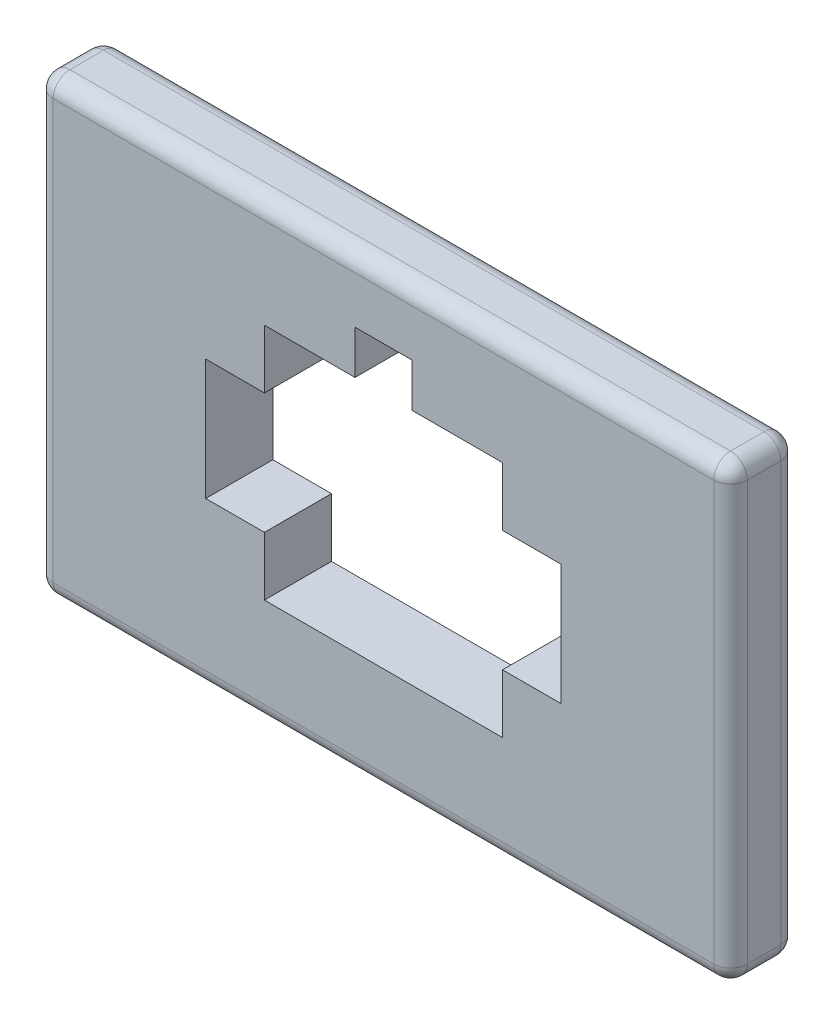
ISO-10303-21;
HEADER;
FILE_DESCRIPTION(('STEP AP214'),'2;1');
FILE_NAME('part.step','',(''),(''),'','','');
FILE_SCHEMA(('AUTOMOTIVE_DESIGN { 1 0 10303 214 1 1 1 1 }'));
ENDSEC;
DATA;
#1=APPLICATION_CONTEXT('core data for automotive mechanical design processes');
#2=APPLICATION_PROTOCOL_DEFINITION('international standard','automotive_design',2000,#1);
#3=PRODUCT_CONTEXT('',#1,'mechanical');
#4=PRODUCT('Part','Part','',(#3));
#5=PRODUCT_RELATED_PRODUCT_CATEGORY('part','',(#4));
#6=PRODUCT_DEFINITION_FORMATION('','',#4);
#7=PRODUCT_DEFINITION_CONTEXT('part definition',#1,'design');
#8=PRODUCT_DEFINITION('design','',#6,#7);
#9=PRODUCT_DEFINITION_SHAPE('','',#8);
#10=(LENGTH_UNIT() NAMED_UNIT(*) SI_UNIT(.MILLI.,.METRE.));
#11=(NAMED_UNIT(*) PLANE_ANGLE_UNIT() SI_UNIT($,.RADIAN.));
#12=(NAMED_UNIT(*) SI_UNIT($,.STERADIAN.) SOLID_ANGLE_UNIT());
#13=UNCERTAINTY_MEASURE_WITH_UNIT(LENGTH_MEASURE(1.E-05),#10,'distance_accuracy_value','');
#14=(GEOMETRIC_REPRESENTATION_CONTEXT(3) GLOBAL_UNCERTAINTY_ASSIGNED_CONTEXT((#13)) GLOBAL_UNIT_ASSIGNED_CONTEXT((#10,
#11,#12)) REPRESENTATION_CONTEXT('',''));
#15=CARTESIAN_POINT('',(0.,0.,0.));
#16=DIRECTION('',(0.,0.,1.));
#17=DIRECTION('',(1.,0.,0.));
#18=AXIS2_PLACEMENT_3D('',#15,#16,#17);
#19=CARTESIAN_POINT('',(10.35,-6.74999999999999,2.));
#20=DIRECTION('',(-1.,0.,0.));
#21=DIRECTION('',(0.,0.,1.));
#22=AXIS2_PLACEMENT_3D('',#19,#20,#21);
#23=PLANE('',#22);
#24=DIRECTION('',(0.,1.,0.));
#25=VECTOR('',#24,1.);
#26=CARTESIAN_POINT('',(10.35,-6.74999999999999,1.5));
#27=LINE('',#26,#25);
#28=CARTESIAN_POINT('',(10.35,6.25000000000001,1.5));
#29=VERTEX_POINT('',#28);
#30=CARTESIAN_POINT('',(10.35,-6.24999999999999,1.5));
#31=VERTEX_POINT('',#30);
#32=EDGE_CURVE('E116',#29,#31,#27,.F.);
#33=ORIENTED_EDGE('',*,*,#32,.T.);
#34=DIRECTION('',(0.,0.,-1.));
#35=VECTOR('',#34,1.);
#36=CARTESIAN_POINT('',(10.35,-6.24999999999999,2.));
#37=LINE('',#36,#35);
#38=CARTESIAN_POINT('',(10.35,-6.24999999999999,0.5));
#39=VERTEX_POINT('',#38);
#40=EDGE_CURVE('E12',#31,#39,#37,.T.);
#41=ORIENTED_EDGE('',*,*,#40,.T.);
#42=DIRECTION('',(0.,1.,0.));
#43=VECTOR('',#42,1.);
#44=CARTESIAN_POINT('',(10.35,6.75000000000001,0.5));
#45=LINE('',#44,#43);
#46=CARTESIAN_POINT('',(10.35,6.25000000000001,0.5));
#47=VERTEX_POINT('',#46);
#48=EDGE_CURVE('E455',#39,#47,#45,.T.);
#49=ORIENTED_EDGE('',*,*,#48,.T.);
#50=DIRECTION('',(0.,0.,-1.));
#51=VECTOR('',#50,1.);
#52=CARTESIAN_POINT('',(10.35,6.25000000000001,2.));
#53=LINE('',#52,#51);
#54=EDGE_CURVE('E457',#47,#29,#53,.F.);
#55=ORIENTED_EDGE('',*,*,#54,.T.);
#56=EDGE_LOOP('',(#33,#41,#49,#55));
#57=FACE_BOUND('',#56,.T.);
#58=ADVANCED_FACE('F107',(#57),#23,.F.);
#59=CARTESIAN_POINT('',(-10.35,6.75000000000001,2.));
#60=DIRECTION('',(0.,-1.,0.));
#61=DIRECTION('',(0.,0.,-1.));
#62=AXIS2_PLACEMENT_3D('',#59,#60,#61);
#63=PLANE('',#62);
#64=DIRECTION('',(0.,0.,-1.));
#65=VECTOR('',#64,1.);
#66=CARTESIAN_POINT('',(-9.84999999999999,6.75000000000001,2.));
#67=LINE('',#66,#65);
#68=CARTESIAN_POINT('',(-9.84999999999999,6.75000000000001,0.5));
#69=VERTEX_POINT('',#68);
#70=CARTESIAN_POINT('',(-9.84999999999999,6.75000000000001,1.5));
#71=VERTEX_POINT('',#70);
#72=EDGE_CURVE('E450',#69,#71,#67,.F.);
#73=ORIENTED_EDGE('',*,*,#72,.T.);
#74=DIRECTION('',(-1.,0.,0.));
#75=VECTOR('',#74,1.);
#76=CARTESIAN_POINT('',(-10.35,6.75000000000001,1.5));
#77=LINE('',#76,#75);
#78=CARTESIAN_POINT('',(9.85000000000001,6.75000000000001,1.5));
#79=VERTEX_POINT('',#78);
#80=EDGE_CURVE('E452',#71,#79,#77,.F.);
#81=ORIENTED_EDGE('',*,*,#80,.T.);
#82=DIRECTION('',(0.,0.,-1.));
#83=VECTOR('',#82,1.);
#84=CARTESIAN_POINT('',(9.85000000000001,6.75000000000001,2.));
#85=LINE('',#84,#83);
#86=CARTESIAN_POINT('',(9.85000000000001,6.75000000000001,0.5));
#87=VERTEX_POINT('',#86);
#88=EDGE_CURVE('E446',#79,#87,#85,.T.);
#89=ORIENTED_EDGE('',*,*,#88,.T.);
#90=DIRECTION('',(-1.,0.,0.));
#91=VECTOR('',#90,1.);
#92=CARTESIAN_POINT('',(-10.35,6.75000000000001,0.5));
#93=LINE('',#92,#91);
#94=EDGE_CURVE('E448',#87,#69,#93,.T.);
#95=ORIENTED_EDGE('',*,*,#94,.T.);
#96=EDGE_LOOP('',(#73,#81,#89,#95));
#97=FACE_BOUND('',#96,.T.);
#98=ADVANCED_FACE('F550',(#97),#63,.F.);
#99=CARTESIAN_POINT('',(-10.35,-6.74999999999999,2.));
#100=DIRECTION('',(1.,0.,0.));
#101=DIRECTION('',(0.,0.,-1.));
#102=AXIS2_PLACEMENT_3D('',#99,#100,#101);
#103=PLANE('',#102);
#104=DIRECTION('',(0.,0.,-1.));
#105=VECTOR('',#104,1.);
#106=CARTESIAN_POINT('',(-10.35,-6.24999999999999,2.));
#107=LINE('',#106,#105);
#108=CARTESIAN_POINT('',(-10.35,-6.24999999999999,0.5));
#109=VERTEX_POINT('',#108);
#110=CARTESIAN_POINT('',(-10.35,-6.24999999999999,1.5));
#111=VERTEX_POINT('',#110);
#112=EDGE_CURVE('E441',#109,#111,#107,.F.);
#113=ORIENTED_EDGE('',*,*,#112,.T.);
#114=DIRECTION('',(0.,-1.,0.));
#115=VECTOR('',#114,1.);
#116=CARTESIAN_POINT('',(-10.35,-6.74999999999999,1.5));
#117=LINE('',#116,#115);
#118=CARTESIAN_POINT('',(-10.35,6.25000000000001,1.5));
#119=VERTEX_POINT('',#118);
#120=EDGE_CURVE('E443',#111,#119,#117,.F.);
#121=ORIENTED_EDGE('',*,*,#120,.T.);
#122=DIRECTION('',(0.,0.,-1.));
#123=VECTOR('',#122,1.);
#124=CARTESIAN_POINT('',(-10.35,6.25000000000001,2.));
#125=LINE('',#124,#123);
#126=CARTESIAN_POINT('',(-10.35,6.25000000000001,0.5));
#127=VERTEX_POINT('',#126);
#128=EDGE_CURVE('E437',#119,#127,#125,.T.);
#129=ORIENTED_EDGE('',*,*,#128,.T.);
#130=DIRECTION('',(0.,-1.,0.));
#131=VECTOR('',#130,1.);
#132=CARTESIAN_POINT('',(-10.35,-6.74999999999999,0.5));
#133=LINE('',#132,#131);
#134=EDGE_CURVE('E439',#127,#109,#133,.T.);
#135=ORIENTED_EDGE('',*,*,#134,.T.);
#136=EDGE_LOOP('',(#113,#121,#129,#135));
#137=FACE_BOUND('',#136,.T.);
#138=ADVANCED_FACE('F541',(#137),#103,.F.);
#139=CARTESIAN_POINT('',(-10.35,-6.74999999999999,2.));
#140=DIRECTION('',(0.,1.,0.));
#141=DIRECTION('',(0.,0.,1.));
#142=AXIS2_PLACEMENT_3D('',#139,#140,#141);
#143=PLANE('',#142);
#144=DIRECTION('',(1.,0.,0.));
#145=VECTOR('',#144,1.);
#146=CARTESIAN_POINT('',(-10.35,-6.74999999999999,1.5));
#147=LINE('',#146,#145);
#148=CARTESIAN_POINT('',(9.85000000000001,-6.74999999999999,1.5));
#149=VERTEX_POINT('',#148);
#150=CARTESIAN_POINT('',(-9.84999999999999,-6.74999999999999,1.5));
#151=VERTEX_POINT('',#150);
#152=EDGE_CURVE('E423',#149,#151,#147,.F.);
#153=ORIENTED_EDGE('',*,*,#152,.T.);
#154=DIRECTION('',(0.,0.,-1.));
#155=VECTOR('',#154,1.);
#156=CARTESIAN_POINT('',(-9.84999999999999,-6.74999999999999,2.));
#157=LINE('',#156,#155);
#158=CARTESIAN_POINT('',(-9.84999999999999,-6.74999999999999,0.5));
#159=VERTEX_POINT('',#158);
#160=EDGE_CURVE('E426',#151,#159,#157,.T.);
#161=ORIENTED_EDGE('',*,*,#160,.T.);
#162=DIRECTION('',(1.,0.,0.));
#163=VECTOR('',#162,1.);
#164=CARTESIAN_POINT('',(10.35,-6.74999999999999,0.5));
#165=LINE('',#164,#163);
#166=CARTESIAN_POINT('',(9.85000000000001,-6.74999999999999,0.5));
#167=VERTEX_POINT('',#166);
#168=EDGE_CURVE('E421',#159,#167,#165,.T.);
#169=ORIENTED_EDGE('',*,*,#168,.T.);
#170=DIRECTION('',(0.,0.,-1.));
#171=VECTOR('',#170,1.);
#172=CARTESIAN_POINT('',(9.85000000000001,-6.74999999999999,2.));
#173=LINE('',#172,#171);
#174=EDGE_CURVE('E419',#167,#149,#173,.F.);
#175=ORIENTED_EDGE('',*,*,#174,.T.);
#176=EDGE_LOOP('',(#153,#161,#169,#175));
#177=FACE_BOUND('',#176,.T.);
#178=ADVANCED_FACE('F643',(#177),#143,.F.);
#179=CARTESIAN_POINT('',(0.,0.,2.));
#180=DIRECTION('',(0.,0.,-1.));
#181=DIRECTION('',(-1.,0.,0.));
#182=AXIS2_PLACEMENT_3D('',#179,#180,#181);
#183=PLANE('',#182);
#184=DIRECTION('',(-1.,0.,0.));
#185=VECTOR('',#184,1.);
#186=CARTESIAN_POINT('',(5.29999999999999,-1.80000000000001,2.));
#187=LINE('',#186,#185);
#188=CARTESIAN_POINT('',(5.29999999999999,-1.80000000000001,2.));
#189=VERTEX_POINT('',#188);
#190=CARTESIAN_POINT('',(3.55000000000002,-1.80000000000001,2.));
#191=VERTEX_POINT('',#190);
#192=EDGE_CURVE('E370',#189,#191,#187,.T.);
#193=ORIENTED_EDGE('',*,*,#192,.T.);
#194=DIRECTION('',(0.,1.,0.));
#195=VECTOR('',#194,1.);
#196=CARTESIAN_POINT('',(3.55000000000002,-3.55000000000001,2.));
#197=LINE('',#196,#195);
#198=CARTESIAN_POINT('',(3.55000000000002,-3.55000000000001,2.));
#199=VERTEX_POINT('',#198);
#200=EDGE_CURVE('E332',#199,#191,#197,.T.);
#201=ORIENTED_EDGE('',*,*,#200,.F.);
#202=DIRECTION('',(-1.,0.,0.));
#203=VECTOR('',#202,1.);
#204=CARTESIAN_POINT('',(3.55000000000002,-3.55000000000001,2.));
#205=LINE('',#204,#203);
#206=CARTESIAN_POINT('',(-3.55000000000003,-3.55000000000001,2.));
#207=VERTEX_POINT('',#206);
#208=EDGE_CURVE('E322',#199,#207,#205,.T.);
#209=ORIENTED_EDGE('',*,*,#208,.T.);
#210=DIRECTION('',(0.,1.,0.));
#211=VECTOR('',#210,1.);
#212=CARTESIAN_POINT('',(-3.55000000000003,-3.55000000000001,2.));
#213=LINE('',#212,#211);
#214=CARTESIAN_POINT('',(-3.55000000000003,-1.80000000000001,2.));
#215=VERTEX_POINT('',#214);
#216=EDGE_CURVE('E325',#207,#215,#213,.T.);
#217=ORIENTED_EDGE('',*,*,#216,.T.);
#218=CARTESIAN_POINT('',(-5.3,-1.80000000000001,2.));
#219=VERTEX_POINT('',#218);
#220=EDGE_CURVE('E389',#215,#219,#187,.T.);
#221=ORIENTED_EDGE('',*,*,#220,.T.);
#222=DIRECTION('',(0.,1.,0.));
#223=VECTOR('',#222,1.);
#224=CARTESIAN_POINT('',(-5.3,-1.80000000000001,2.));
#225=LINE('',#224,#223);
#226=CARTESIAN_POINT('',(-5.3,1.80000000000001,2.));
#227=VERTEX_POINT('',#226);
#228=EDGE_CURVE('E386',#219,#227,#225,.T.);
#229=ORIENTED_EDGE('',*,*,#228,.T.);
#230=DIRECTION('',(-1.,0.,0.));
#231=VECTOR('',#230,1.);
#232=CARTESIAN_POINT('',(5.29999999999999,1.80000000000001,2.));
#233=LINE('',#232,#231);
#234=CARTESIAN_POINT('',(-3.55000000000003,1.80000000000001,2.));
#235=VERTEX_POINT('',#234);
#236=EDGE_CURVE('E382',#235,#227,#233,.T.);
#237=ORIENTED_EDGE('',*,*,#236,.F.);
#238=CARTESIAN_POINT('',(-3.55000000000003,3.55000000000001,2.));
#239=VERTEX_POINT('',#238);
#240=EDGE_CURVE('E337',#235,#239,#213,.T.);
#241=ORIENTED_EDGE('',*,*,#240,.T.);
#242=DIRECTION('',(-1.,0.,0.));
#243=VECTOR('',#242,1.);
#244=CARTESIAN_POINT('',(3.55000000000002,3.55000000000001,2.));
#245=LINE('',#244,#243);
#246=CARTESIAN_POINT('',(-0.850000000000024,3.55000000000001,2.));
#247=VERTEX_POINT('',#246);
#248=EDGE_CURVE('E335',#247,#239,#245,.T.);
#249=ORIENTED_EDGE('',*,*,#248,.F.);
#250=DIRECTION('',(0.,-1.,0.));
#251=VECTOR('',#250,1.);
#252=CARTESIAN_POINT('',(-0.850000000000025,4.85000000000001,2.));
#253=LINE('',#252,#251);
#254=CARTESIAN_POINT('',(-0.850000000000025,4.85000000000001,2.));
#255=VERTEX_POINT('',#254);
#256=EDGE_CURVE('E350',#255,#247,#253,.T.);
#257=ORIENTED_EDGE('',*,*,#256,.F.);
#258=DIRECTION('',(1.,0.,0.));
#259=VECTOR('',#258,1.);
#260=CARTESIAN_POINT('',(-0.850000000000025,4.85000000000001,2.));
#261=LINE('',#260,#259);
#262=CARTESIAN_POINT('',(0.850000000000024,4.85000000000001,2.));
#263=VERTEX_POINT('',#262);
#264=EDGE_CURVE('E356',#255,#263,#261,.T.);
#265=ORIENTED_EDGE('',*,*,#264,.T.);
#266=DIRECTION('',(0.,-1.,0.));
#267=VECTOR('',#266,1.);
#268=CARTESIAN_POINT('',(0.850000000000024,4.85000000000001,2.));
#269=LINE('',#268,#267);
#270=CARTESIAN_POINT('',(0.850000000000024,3.55000000000001,2.));
#271=VERTEX_POINT('',#270);
#272=EDGE_CURVE('E359',#263,#271,#269,.T.);
#273=ORIENTED_EDGE('',*,*,#272,.T.);
#274=CARTESIAN_POINT('',(3.55000000000002,3.55000000000001,2.));
#275=VERTEX_POINT('',#274);
#276=EDGE_CURVE('E124',#275,#271,#245,.T.);
#277=ORIENTED_EDGE('',*,*,#276,.F.);
#278=CARTESIAN_POINT('',(3.55000000000002,1.80000000000001,2.));
#279=VERTEX_POINT('',#278);
#280=EDGE_CURVE('E302',#279,#275,#197,.T.);
#281=ORIENTED_EDGE('',*,*,#280,.F.);
#282=CARTESIAN_POINT('',(5.29999999999999,1.80000000000001,2.));
#283=VERTEX_POINT('',#282);
#284=EDGE_CURVE('E383',#283,#279,#233,.T.);
#285=ORIENTED_EDGE('',*,*,#284,.F.);
#286=DIRECTION('',(0.,1.,0.));
#287=VECTOR('',#286,1.);
#288=CARTESIAN_POINT('',(5.29999999999999,-1.80000000000001,2.));
#289=LINE('',#288,#287);
#290=EDGE_CURVE('E379',#189,#283,#289,.T.);
#291=ORIENTED_EDGE('',*,*,#290,.F.);
#292=EDGE_LOOP('',(#193,#201,#209,#217,#221,#229,#237,#241,#249,#257,#265,#273,#277,#281,#285,#291));
#293=FACE_BOUND('',#292,.T.);
#294=DIRECTION('',(0.,-1.,0.));
#295=VECTOR('',#294,1.);
#296=CARTESIAN_POINT('',(-9.84999999999999,0.,2.));
#297=LINE('',#296,#295);
#298=CARTESIAN_POINT('',(-9.84999999999999,6.25000000000001,2.));
#299=VERTEX_POINT('',#298);
#300=CARTESIAN_POINT('',(-9.84999999999999,-6.24999999999999,2.));
#301=VERTEX_POINT('',#300);
#302=EDGE_CURVE('E414',#299,#301,#297,.T.);
#303=ORIENTED_EDGE('',*,*,#302,.T.);
#304=DIRECTION('',(1.,0.,0.));
#305=VECTOR('',#304,1.);
#306=CARTESIAN_POINT('',(0.,-6.24999999999999,2.));
#307=LINE('',#306,#305);
#308=CARTESIAN_POINT('',(9.85000000000001,-6.24999999999999,2.));
#309=VERTEX_POINT('',#308);
#310=EDGE_CURVE('E416',#301,#309,#307,.T.);
#311=ORIENTED_EDGE('',*,*,#310,.T.);
#312=DIRECTION('',(0.,1.,0.));
#313=VECTOR('',#312,1.);
#314=CARTESIAN_POINT('',(9.85000000000001,0.,2.));
#315=LINE('',#314,#313);
#316=CARTESIAN_POINT('',(9.85000000000001,6.25000000000001,2.));
#317=VERTEX_POINT('',#316);
#318=EDGE_CURVE('E410',#309,#317,#315,.T.);
#319=ORIENTED_EDGE('',*,*,#318,.T.);
#320=DIRECTION('',(-1.,0.,0.));
#321=VECTOR('',#320,1.);
#322=CARTESIAN_POINT('',(0.,6.25000000000001,2.));
#323=LINE('',#322,#321);
#324=EDGE_CURVE('E412',#317,#299,#323,.T.);
#325=ORIENTED_EDGE('',*,*,#324,.T.);
#326=EDGE_LOOP('',(#303,#311,#319,#325));
#327=FACE_BOUND('',#326,.T.);
#328=ADVANCED_FACE('F649',(#293,#327),#183,.F.);
#329=CARTESIAN_POINT('',(0.,0.,0.));
#330=DIRECTION('',(0.,0.,-1.));
#331=DIRECTION('',(-1.,0.,0.));
#332=AXIS2_PLACEMENT_3D('',#329,#330,#331);
#333=PLANE('',#332);
#334=DIRECTION('',(0.,1.,0.));
#335=VECTOR('',#334,1.);
#336=CARTESIAN_POINT('',(3.55000000000002,-3.55000000000001,0.));
#337=LINE('',#336,#335);
#338=CARTESIAN_POINT('',(3.55000000000002,-3.55000000000001,0.));
#339=VERTEX_POINT('',#338);
#340=CARTESIAN_POINT('',(3.55000000000002,-1.80000000000001,0.));
#341=VERTEX_POINT('',#340);
#342=EDGE_CURVE('E321',#339,#341,#337,.T.);
#343=ORIENTED_EDGE('',*,*,#342,.T.);
#344=DIRECTION('',(-1.,0.,0.));
#345=VECTOR('',#344,1.);
#346=CARTESIAN_POINT('',(5.29999999999999,-1.80000000000001,0.));
#347=LINE('',#346,#345);
#348=CARTESIAN_POINT('',(5.29999999999999,-1.80000000000001,0.));
#349=VERTEX_POINT('',#348);
#350=EDGE_CURVE('E375',#349,#341,#347,.T.);
#351=ORIENTED_EDGE('',*,*,#350,.F.);
#352=DIRECTION('',(0.,1.,0.));
#353=VECTOR('',#352,1.);
#354=CARTESIAN_POINT('',(5.29999999999999,-1.80000000000001,0.));
#355=LINE('',#354,#353);
#356=CARTESIAN_POINT('',(5.29999999999999,1.80000000000001,0.));
#357=VERTEX_POINT('',#356);
#358=EDGE_CURVE('E367',#349,#357,#355,.T.);
#359=ORIENTED_EDGE('',*,*,#358,.T.);
#360=DIRECTION('',(-1.,0.,0.));
#361=VECTOR('',#360,1.);
#362=CARTESIAN_POINT('',(5.29999999999999,1.80000000000001,0.));
#363=LINE('',#362,#361);
#364=CARTESIAN_POINT('',(3.55000000000002,1.80000000000001,0.));
#365=VERTEX_POINT('',#364);
#366=EDGE_CURVE('E320',#357,#365,#363,.T.);
#367=ORIENTED_EDGE('',*,*,#366,.T.);
#368=CARTESIAN_POINT('',(3.55000000000002,3.55000000000001,0.));
#369=VERTEX_POINT('',#368);
#370=EDGE_CURVE('E299',#365,#369,#337,.T.);
#371=ORIENTED_EDGE('',*,*,#370,.T.);
#372=DIRECTION('',(-1.,0.,0.));
#373=VECTOR('',#372,1.);
#374=CARTESIAN_POINT('',(3.55000000000002,3.55000000000001,0.));
#375=LINE('',#374,#373);
#376=CARTESIAN_POINT('',(0.850000000000025,3.55000000000001,0.));
#377=VERTEX_POINT('',#376);
#378=EDGE_CURVE('E307',#369,#377,#375,.T.);
#379=ORIENTED_EDGE('',*,*,#378,.T.);
#380=DIRECTION('',(0.,-1.,0.));
#381=VECTOR('',#380,1.);
#382=CARTESIAN_POINT('',(0.850000000000024,4.85000000000001,0.));
#383=LINE('',#382,#381);
#384=CARTESIAN_POINT('',(0.850000000000024,4.85000000000001,0.));
#385=VERTEX_POINT('',#384);
#386=EDGE_CURVE('E349',#385,#377,#383,.T.);
#387=ORIENTED_EDGE('',*,*,#386,.F.);
#388=DIRECTION('',(1.,0.,0.));
#389=VECTOR('',#388,1.);
#390=CARTESIAN_POINT('',(-0.850000000000025,4.85000000000001,0.));
#391=LINE('',#390,#389);
#392=CARTESIAN_POINT('',(-0.850000000000025,4.85000000000001,0.));
#393=VERTEX_POINT('',#392);
#394=EDGE_CURVE('E347',#393,#385,#391,.T.);
#395=ORIENTED_EDGE('',*,*,#394,.F.);
#396=DIRECTION('',(0.,-1.,0.));
#397=VECTOR('',#396,1.);
#398=CARTESIAN_POINT('',(-0.850000000000025,4.85000000000001,0.));
#399=LINE('',#398,#397);
#400=CARTESIAN_POINT('',(-0.850000000000024,3.55000000000001,0.));
#401=VERTEX_POINT('',#400);
#402=EDGE_CURVE('E352',#393,#401,#399,.T.);
#403=ORIENTED_EDGE('',*,*,#402,.T.);
#404=CARTESIAN_POINT('',(-3.55000000000003,3.55000000000001,0.));
#405=VERTEX_POINT('',#404);
#406=EDGE_CURVE('E313',#401,#405,#375,.T.);
#407=ORIENTED_EDGE('',*,*,#406,.T.);
#408=DIRECTION('',(0.,1.,0.));
#409=VECTOR('',#408,1.);
#410=CARTESIAN_POINT('',(-3.55000000000003,-3.55000000000001,0.));
#411=LINE('',#410,#409);
#412=CARTESIAN_POINT('',(-3.55000000000003,1.80000000000001,0.));
#413=VERTEX_POINT('',#412);
#414=EDGE_CURVE('E312',#413,#405,#411,.T.);
#415=ORIENTED_EDGE('',*,*,#414,.F.);
#416=CARTESIAN_POINT('',(-5.3,1.80000000000001,0.));
#417=VERTEX_POINT('',#416);
#418=EDGE_CURVE('E369',#413,#417,#363,.T.);
#419=ORIENTED_EDGE('',*,*,#418,.T.);
#420=DIRECTION('',(0.,1.,0.));
#421=VECTOR('',#420,1.);
#422=CARTESIAN_POINT('',(-5.3,-1.80000000000001,0.));
#423=LINE('',#422,#421);
#424=CARTESIAN_POINT('',(-5.3,-1.80000000000001,0.));
#425=VERTEX_POINT('',#424);
#426=EDGE_CURVE('E372',#425,#417,#423,.T.);
#427=ORIENTED_EDGE('',*,*,#426,.F.);
#428=CARTESIAN_POINT('',(-3.55000000000003,-1.80000000000001,0.));
#429=VERTEX_POINT('',#428);
#430=EDGE_CURVE('E374',#429,#425,#347,.T.);
#431=ORIENTED_EDGE('',*,*,#430,.F.);
#432=CARTESIAN_POINT('',(-3.55000000000003,-3.55000000000001,0.));
#433=VERTEX_POINT('',#432);
#434=EDGE_CURVE('E328',#433,#429,#411,.T.);
#435=ORIENTED_EDGE('',*,*,#434,.F.);
#436=DIRECTION('',(-1.,0.,0.));
#437=VECTOR('',#436,1.);
#438=CARTESIAN_POINT('',(3.55000000000002,-3.55000000000001,0.));
#439=LINE('',#438,#437);
#440=EDGE_CURVE('E304',#339,#433,#439,.T.);
#441=ORIENTED_EDGE('',*,*,#440,.F.);
#442=EDGE_LOOP('',(#343,#351,#359,#367,#371,#379,#387,#395,#403,#407,#415,#419,#427,#431,#435,#441));
#443=FACE_BOUND('',#442,.T.);
#444=DIRECTION('',(0.,1.,0.));
#445=VECTOR('',#444,1.);
#446=CARTESIAN_POINT('',(9.85000000000001,-6.74999999999999,0.));
#447=LINE('',#446,#445);
#448=CARTESIAN_POINT('',(9.85000000000001,6.25000000000001,0.));
#449=VERTEX_POINT('',#448);
#450=CARTESIAN_POINT('',(9.85000000000001,-6.24999999999999,0.));
#451=VERTEX_POINT('',#450);
#452=EDGE_CURVE('E428',#449,#451,#447,.F.);
#453=ORIENTED_EDGE('',*,*,#452,.T.);
#454=DIRECTION('',(1.,0.,0.));
#455=VECTOR('',#454,1.);
#456=CARTESIAN_POINT('',(-10.35,-6.24999999999999,0.));
#457=LINE('',#456,#455);
#458=CARTESIAN_POINT('',(-9.84999999999999,-6.24999999999999,0.));
#459=VERTEX_POINT('',#458);
#460=EDGE_CURVE('E434',#451,#459,#457,.F.);
#461=ORIENTED_EDGE('',*,*,#460,.T.);
#462=DIRECTION('',(0.,-1.,0.));
#463=VECTOR('',#462,1.);
#464=CARTESIAN_POINT('',(-9.84999999999999,6.75000000000001,0.));
#465=LINE('',#464,#463);
#466=CARTESIAN_POINT('',(-9.84999999999999,6.25000000000001,0.));
#467=VERTEX_POINT('',#466);
#468=EDGE_CURVE('E432',#459,#467,#465,.F.);
#469=ORIENTED_EDGE('',*,*,#468,.T.);
#470=DIRECTION('',(-1.,0.,0.));
#471=VECTOR('',#470,1.);
#472=CARTESIAN_POINT('',(10.35,6.25000000000001,0.));
#473=LINE('',#472,#471);
#474=EDGE_CURVE('E430',#467,#449,#473,.F.);
#475=ORIENTED_EDGE('',*,*,#474,.T.);
#476=EDGE_LOOP('',(#453,#461,#469,#475));
#477=FACE_BOUND('',#476,.T.);
#478=ADVANCED_FACE('F316',(#443,#477),#333,.T.);
#479=CARTESIAN_POINT('',(-10.35,6.25000000000001,0.5));
#480=DIRECTION('',(1.,0.,0.));
#481=DIRECTION('',(0.,0.,-1.));
#482=AXIS2_PLACEMENT_3D('',#479,#480,#481);
#483=CYLINDRICAL_SURFACE('',#482,0.5);
#484=CARTESIAN_POINT('',(-9.84999999999999,6.25000000000001,0.5));
#485=DIRECTION('',(-1.,0.,0.));
#486=DIRECTION('',(0.,0.,1.));
#487=AXIS2_PLACEMENT_3D('',#484,#485,#486);
#488=CIRCLE('',#487,0.5);
#489=EDGE_CURVE('E111',#69,#467,#488,.T.);
#490=ORIENTED_EDGE('',*,*,#489,.F.);
#491=ORIENTED_EDGE('',*,*,#94,.F.);
#492=CARTESIAN_POINT('',(9.85000000000001,6.25000000000001,0.5));
#493=DIRECTION('',(1.,0.,0.));
#494=DIRECTION('',(0.,0.,-1.));
#495=AXIS2_PLACEMENT_3D('',#492,#493,#494);
#496=CIRCLE('',#495,0.5);
#497=EDGE_CURVE('E518',#449,#87,#496,.T.);
#498=ORIENTED_EDGE('',*,*,#497,.F.);
#499=ORIENTED_EDGE('',*,*,#474,.F.);
#500=EDGE_LOOP('',(#490,#491,#498,#499));
#501=FACE_BOUND('',#500,.T.);
#502=ADVANCED_FACE('F109',(#501),#483,.T.);
#503=CARTESIAN_POINT('',(-9.84999999999999,6.25000000000001,0.5));
#504=DIRECTION('',(0.,0.,1.));
#505=DIRECTION('',(1.,0.,0.));
#506=AXIS2_PLACEMENT_3D('',#503,#504,#505);
#507=SPHERICAL_SURFACE('',#506,0.5);
#508=CARTESIAN_POINT('',(-9.84999999999999,6.25000000000001,0.5));
#509=DIRECTION('',(0.,0.,-1.));
#510=DIRECTION('',(-1.,0.,0.));
#511=AXIS2_PLACEMENT_3D('',#508,#509,#510);
#512=CIRCLE('',#511,0.5);
#513=EDGE_CURVE('E513',#69,#127,#512,.F.);
#514=ORIENTED_EDGE('',*,*,#513,.F.);
#515=ORIENTED_EDGE('',*,*,#489,.T.);
#516=CARTESIAN_POINT('',(-9.84999999999999,6.25000000000001,0.5));
#517=DIRECTION('',(0.,1.,0.));
#518=DIRECTION('',(0.,0.,1.));
#519=AXIS2_PLACEMENT_3D('',#516,#517,#518);
#520=CIRCLE('',#519,0.5);
#521=EDGE_CURVE('E516',#127,#467,#520,.F.);
#522=ORIENTED_EDGE('',*,*,#521,.F.);
#523=EDGE_LOOP('',(#514,#515,#522));
#524=FACE_BOUND('',#523,.T.);
#525=ADVANCED_FACE('F529',(#524),#507,.T.);
#526=CARTESIAN_POINT('',(9.85000000000001,6.25000000000001,0.5));
#527=DIRECTION('',(0.,0.,1.));
#528=DIRECTION('',(1.,0.,0.));
#529=AXIS2_PLACEMENT_3D('',#526,#527,#528);
#530=SPHERICAL_SURFACE('',#529,0.5);
#531=CARTESIAN_POINT('',(9.85000000000001,6.25000000000001,0.5));
#532=DIRECTION('',(0.,1.,0.));
#533=DIRECTION('',(0.,0.,1.));
#534=AXIS2_PLACEMENT_3D('',#531,#532,#533);
#535=CIRCLE('',#534,0.5);
#536=EDGE_CURVE('E507',#449,#47,#535,.F.);
#537=ORIENTED_EDGE('',*,*,#536,.F.);
#538=ORIENTED_EDGE('',*,*,#497,.T.);
#539=CARTESIAN_POINT('',(9.85000000000001,6.25000000000001,0.5));
#540=DIRECTION('',(0.,0.,-1.));
#541=DIRECTION('',(-1.,0.,0.));
#542=AXIS2_PLACEMENT_3D('',#539,#540,#541);
#543=CIRCLE('',#542,0.5);
#544=EDGE_CURVE('E510',#47,#87,#543,.F.);
#545=ORIENTED_EDGE('',*,*,#544,.F.);
#546=EDGE_LOOP('',(#537,#538,#545));
#547=FACE_BOUND('',#546,.T.);
#548=ADVANCED_FACE('F565',(#547),#530,.T.);
#549=CARTESIAN_POINT('',(-9.84999999999999,-6.74999999999999,0.5));
#550=DIRECTION('',(0.,1.,0.));
#551=DIRECTION('',(0.,0.,1.));
#552=AXIS2_PLACEMENT_3D('',#549,#550,#551);
#553=CYLINDRICAL_SURFACE('',#552,0.5);
#554=ORIENTED_EDGE('',*,*,#521,.T.);
#555=ORIENTED_EDGE('',*,*,#468,.F.);
#556=CARTESIAN_POINT('',(-9.84999999999999,-6.24999999999999,0.5));
#557=DIRECTION('',(0.,-1.,0.));
#558=DIRECTION('',(0.,0.,-1.));
#559=AXIS2_PLACEMENT_3D('',#556,#557,#558);
#560=CIRCLE('',#559,0.5);
#561=EDGE_CURVE('E502',#109,#459,#560,.T.);
#562=ORIENTED_EDGE('',*,*,#561,.F.);
#563=ORIENTED_EDGE('',*,*,#134,.F.);
#564=EDGE_LOOP('',(#554,#555,#562,#563));
#565=FACE_BOUND('',#564,.T.);
#566=ADVANCED_FACE('F537',(#565),#553,.T.);
#567=CARTESIAN_POINT('',(-9.84999999999999,6.25000000000001,2.));
#568=DIRECTION('',(0.,0.,-1.));
#569=DIRECTION('',(-1.,0.,0.));
#570=AXIS2_PLACEMENT_3D('',#567,#568,#569);
#571=CYLINDRICAL_SURFACE('',#570,0.5);
#572=ORIENTED_EDGE('',*,*,#513,.T.);
#573=ORIENTED_EDGE('',*,*,#128,.F.);
#574=CARTESIAN_POINT('',(-9.84999999999999,6.25000000000001,1.5));
#575=DIRECTION('',(0.,0.,1.));
#576=DIRECTION('',(1.,0.,0.));
#577=AXIS2_PLACEMENT_3D('',#574,#575,#576);
#578=CIRCLE('',#577,0.5);
#579=EDGE_CURVE('E499',#71,#119,#578,.T.);
#580=ORIENTED_EDGE('',*,*,#579,.F.);
#581=ORIENTED_EDGE('',*,*,#72,.F.);
#582=EDGE_LOOP('',(#572,#573,#580,#581));
#583=FACE_BOUND('',#582,.T.);
#584=ADVANCED_FACE('F547',(#583),#571,.T.);
#585=CARTESIAN_POINT('',(0.,6.25000000000001,1.5));
#586=DIRECTION('',(-1.,0.,0.));
#587=DIRECTION('',(0.,0.,1.));
#588=AXIS2_PLACEMENT_3D('',#585,#586,#587);
#589=CYLINDRICAL_SURFACE('',#588,0.5);
#590=CARTESIAN_POINT('',(9.85000000000001,6.25000000000001,1.5));
#591=DIRECTION('',(1.,0.,0.));
#592=DIRECTION('',(0.,0.,-1.));
#593=AXIS2_PLACEMENT_3D('',#590,#591,#592);
#594=CIRCLE('',#593,0.5);
#595=EDGE_CURVE('E493',#79,#317,#594,.T.);
#596=ORIENTED_EDGE('',*,*,#595,.F.);
#597=ORIENTED_EDGE('',*,*,#80,.F.);
#598=CARTESIAN_POINT('',(-9.84999999999999,6.25000000000001,1.5));
#599=DIRECTION('',(-1.,0.,0.));
#600=DIRECTION('',(0.,0.,1.));
#601=AXIS2_PLACEMENT_3D('',#598,#599,#600);
#602=CIRCLE('',#601,0.5);
#603=EDGE_CURVE('E496',#299,#71,#602,.T.);
#604=ORIENTED_EDGE('',*,*,#603,.F.);
#605=ORIENTED_EDGE('',*,*,#324,.F.);
#606=EDGE_LOOP('',(#596,#597,#604,#605));
#607=FACE_BOUND('',#606,.T.);
#608=ADVANCED_FACE('F554',(#607),#589,.T.);
#609=CARTESIAN_POINT('',(9.85000000000001,6.25000000000001,2.));
#610=DIRECTION('',(0.,0.,-1.));
#611=DIRECTION('',(-1.,0.,0.));
#612=AXIS2_PLACEMENT_3D('',#609,#610,#611);
#613=CYLINDRICAL_SURFACE('',#612,0.5);
#614=ORIENTED_EDGE('',*,*,#544,.T.);
#615=ORIENTED_EDGE('',*,*,#88,.F.);
#616=CARTESIAN_POINT('',(9.85000000000001,6.25000000000001,1.5));
#617=DIRECTION('',(0.,0.,1.));
#618=DIRECTION('',(1.,0.,0.));
#619=AXIS2_PLACEMENT_3D('',#616,#617,#618);
#620=CIRCLE('',#619,0.5);
#621=EDGE_CURVE('E491',#29,#79,#620,.T.);
#622=ORIENTED_EDGE('',*,*,#621,.F.);
#623=ORIENTED_EDGE('',*,*,#54,.F.);
#624=EDGE_LOOP('',(#614,#615,#622,#623));
#625=FACE_BOUND('',#624,.T.);
#626=ADVANCED_FACE('F562',(#625),#613,.T.);
#627=CARTESIAN_POINT('',(9.85000000000001,-6.74999999999999,0.5));
#628=DIRECTION('',(0.,-1.,0.));
#629=DIRECTION('',(0.,0.,-1.));
#630=AXIS2_PLACEMENT_3D('',#627,#628,#629);
#631=CYLINDRICAL_SURFACE('',#630,0.5);
#632=ORIENTED_EDGE('',*,*,#536,.T.);
#633=ORIENTED_EDGE('',*,*,#48,.F.);
#634=CARTESIAN_POINT('',(9.85000000000001,-6.24999999999999,0.5));
#635=DIRECTION('',(0.,-1.,0.));
#636=DIRECTION('',(0.,0.,-1.));
#637=AXIS2_PLACEMENT_3D('',#634,#635,#636);
#638=CIRCLE('',#637,0.5);
#639=EDGE_CURVE('E488',#451,#39,#638,.T.);
#640=ORIENTED_EDGE('',*,*,#639,.F.);
#641=ORIENTED_EDGE('',*,*,#452,.F.);
#642=EDGE_LOOP('',(#632,#633,#640,#641));
#643=FACE_BOUND('',#642,.T.);
#644=ADVANCED_FACE('F569',(#643),#631,.T.);
#645=CARTESIAN_POINT('',(-10.35,-6.24999999999999,0.5));
#646=DIRECTION('',(-1.,0.,0.));
#647=DIRECTION('',(0.,0.,1.));
#648=AXIS2_PLACEMENT_3D('',#645,#646,#647);
#649=CYLINDRICAL_SURFACE('',#648,0.5);
#650=CARTESIAN_POINT('',(-9.84999999999999,-6.24999999999999,0.5));
#651=DIRECTION('',(-1.,0.,0.));
#652=DIRECTION('',(0.,0.,1.));
#653=AXIS2_PLACEMENT_3D('',#650,#651,#652);
#654=CIRCLE('',#653,0.5);
#655=EDGE_CURVE('E504',#459,#159,#654,.T.);
#656=ORIENTED_EDGE('',*,*,#655,.F.);
#657=ORIENTED_EDGE('',*,*,#460,.F.);
#658=CARTESIAN_POINT('',(9.85000000000001,-6.24999999999999,0.5));
#659=DIRECTION('',(1.,0.,0.));
#660=DIRECTION('',(0.,0.,-1.));
#661=AXIS2_PLACEMENT_3D('',#658,#659,#660);
#662=CIRCLE('',#661,0.5);
#663=EDGE_CURVE('E485',#167,#451,#662,.T.);
#664=ORIENTED_EDGE('',*,*,#663,.F.);
#665=ORIENTED_EDGE('',*,*,#168,.F.);
#666=EDGE_LOOP('',(#656,#657,#664,#665));
#667=FACE_BOUND('',#666,.T.);
#668=ADVANCED_FACE('F574',(#667),#649,.T.);
#669=CARTESIAN_POINT('',(-9.84999999999999,-6.24999999999999,0.5));
#670=DIRECTION('',(0.,0.,1.));
#671=DIRECTION('',(1.,0.,0.));
#672=AXIS2_PLACEMENT_3D('',#669,#670,#671);
#673=SPHERICAL_SURFACE('',#672,0.5);
#674=ORIENTED_EDGE('',*,*,#561,.T.);
#675=ORIENTED_EDGE('',*,*,#655,.T.);
#676=CARTESIAN_POINT('',(-9.84999999999999,-6.24999999999999,0.5));
#677=DIRECTION('',(0.,0.,-1.));
#678=DIRECTION('',(-1.,0.,0.));
#679=AXIS2_PLACEMENT_3D('',#676,#677,#678);
#680=CIRCLE('',#679,0.5);
#681=EDGE_CURVE('E482',#109,#159,#680,.F.);
#682=ORIENTED_EDGE('',*,*,#681,.F.);
#683=EDGE_LOOP('',(#674,#675,#682));
#684=FACE_BOUND('',#683,.T.);
#685=ADVANCED_FACE('F578',(#684),#673,.T.);
#686=CARTESIAN_POINT('',(-9.84999999999999,6.25000000000001,1.5));
#687=DIRECTION('',(0.,0.,1.));
#688=DIRECTION('',(1.,0.,0.));
#689=AXIS2_PLACEMENT_3D('',#686,#687,#688);
#690=SPHERICAL_SURFACE('',#689,0.5);
#691=ORIENTED_EDGE('',*,*,#603,.T.);
#692=ORIENTED_EDGE('',*,*,#579,.T.);
#693=CARTESIAN_POINT('',(-9.84999999999999,6.25000000000001,1.5));
#694=DIRECTION('',(0.,1.,0.));
#695=DIRECTION('',(0.,0.,1.));
#696=AXIS2_PLACEMENT_3D('',#693,#694,#695);
#697=CIRCLE('',#696,0.5);
#698=EDGE_CURVE('E480',#299,#119,#697,.F.);
#699=ORIENTED_EDGE('',*,*,#698,.F.);
#700=EDGE_LOOP('',(#691,#692,#699));
#701=FACE_BOUND('',#700,.T.);
#702=ADVANCED_FACE('F592',(#701),#690,.T.);
#703=CARTESIAN_POINT('',(9.85000000000001,6.25000000000001,1.5));
#704=DIRECTION('',(0.,0.,1.));
#705=DIRECTION('',(1.,0.,0.));
#706=AXIS2_PLACEMENT_3D('',#703,#704,#705);
#707=SPHERICAL_SURFACE('',#706,0.5);
#708=ORIENTED_EDGE('',*,*,#621,.T.);
#709=ORIENTED_EDGE('',*,*,#595,.T.);
#710=CARTESIAN_POINT('',(9.85000000000001,6.25000000000001,1.5));
#711=DIRECTION('',(0.,1.,0.));
#712=DIRECTION('',(0.,0.,1.));
#713=AXIS2_PLACEMENT_3D('',#710,#711,#712);
#714=CIRCLE('',#713,0.5);
#715=EDGE_CURVE('E477',#29,#317,#714,.F.);
#716=ORIENTED_EDGE('',*,*,#715,.F.);
#717=EDGE_LOOP('',(#708,#709,#716));
#718=FACE_BOUND('',#717,.T.);
#719=ADVANCED_FACE('F594',(#718),#707,.T.);
#720=CARTESIAN_POINT('',(9.85000000000001,-6.24999999999999,0.5));
#721=DIRECTION('',(0.,0.,1.));
#722=DIRECTION('',(1.,0.,0.));
#723=AXIS2_PLACEMENT_3D('',#720,#721,#722);
#724=SPHERICAL_SURFACE('',#723,0.5);
#725=ORIENTED_EDGE('',*,*,#663,.T.);
#726=ORIENTED_EDGE('',*,*,#639,.T.);
#727=CARTESIAN_POINT('',(9.85000000000001,-6.24999999999999,0.5));
#728=DIRECTION('',(0.,0.,-1.));
#729=DIRECTION('',(-1.,0.,0.));
#730=AXIS2_PLACEMENT_3D('',#727,#728,#729);
#731=CIRCLE('',#730,0.5);
#732=EDGE_CURVE('E475',#167,#39,#731,.F.);
#733=ORIENTED_EDGE('',*,*,#732,.F.);
#734=EDGE_LOOP('',(#725,#726,#733));
#735=FACE_BOUND('',#734,.T.);
#736=ADVANCED_FACE('F600',(#735),#724,.T.);
#737=CARTESIAN_POINT('',(-9.84999999999999,-6.24999999999999,2.));
#738=DIRECTION('',(0.,0.,-1.));
#739=DIRECTION('',(-1.,0.,0.));
#740=AXIS2_PLACEMENT_3D('',#737,#738,#739);
#741=CYLINDRICAL_SURFACE('',#740,0.5);
#742=ORIENTED_EDGE('',*,*,#681,.T.);
#743=ORIENTED_EDGE('',*,*,#160,.F.);
#744=CARTESIAN_POINT('',(-9.84999999999999,-6.24999999999999,1.5));
#745=DIRECTION('',(0.,0.,1.));
#746=DIRECTION('',(1.,0.,0.));
#747=AXIS2_PLACEMENT_3D('',#744,#745,#746);
#748=CIRCLE('',#747,0.5);
#749=EDGE_CURVE('E472',#111,#151,#748,.T.);
#750=ORIENTED_EDGE('',*,*,#749,.F.);
#751=ORIENTED_EDGE('',*,*,#112,.F.);
#752=EDGE_LOOP('',(#742,#743,#750,#751));
#753=FACE_BOUND('',#752,.T.);
#754=ADVANCED_FACE('F581',(#753),#741,.T.);
#755=CARTESIAN_POINT('',(-9.84999999999999,0.,1.5));
#756=DIRECTION('',(0.,-1.,0.));
#757=DIRECTION('',(0.,0.,-1.));
#758=AXIS2_PLACEMENT_3D('',#755,#756,#757);
#759=CYLINDRICAL_SURFACE('',#758,0.5);
#760=ORIENTED_EDGE('',*,*,#698,.T.);
#761=ORIENTED_EDGE('',*,*,#120,.F.);
#762=CARTESIAN_POINT('',(-9.84999999999999,-6.24999999999999,1.5));
#763=DIRECTION('',(0.,-1.,0.));
#764=DIRECTION('',(0.,0.,-1.));
#765=AXIS2_PLACEMENT_3D('',#762,#763,#764);
#766=CIRCLE('',#765,0.5);
#767=EDGE_CURVE('E469',#301,#111,#766,.T.);
#768=ORIENTED_EDGE('',*,*,#767,.F.);
#769=ORIENTED_EDGE('',*,*,#302,.F.);
#770=EDGE_LOOP('',(#760,#761,#768,#769));
#771=FACE_BOUND('',#770,.T.);
#772=ADVANCED_FACE('F590',(#771),#759,.T.);
#773=CARTESIAN_POINT('',(9.85000000000001,0.,1.5));
#774=DIRECTION('',(0.,1.,0.));
#775=DIRECTION('',(0.,0.,1.));
#776=AXIS2_PLACEMENT_3D('',#773,#774,#775);
#777=CYLINDRICAL_SURFACE('',#776,0.5);
#778=ORIENTED_EDGE('',*,*,#715,.T.);
#779=ORIENTED_EDGE('',*,*,#318,.F.);
#780=CARTESIAN_POINT('',(9.85000000000001,-6.24999999999999,1.5));
#781=DIRECTION('',(0.,-1.,0.));
#782=DIRECTION('',(0.,0.,-1.));
#783=AXIS2_PLACEMENT_3D('',#780,#781,#782);
#784=CIRCLE('',#783,0.5);
#785=EDGE_CURVE('E466',#31,#309,#784,.T.);
#786=ORIENTED_EDGE('',*,*,#785,.F.);
#787=ORIENTED_EDGE('',*,*,#32,.F.);
#788=EDGE_LOOP('',(#778,#779,#786,#787));
#789=FACE_BOUND('',#788,.T.);
#790=ADVANCED_FACE('F625',(#789),#777,.T.);
#791=CARTESIAN_POINT('',(9.85000000000001,-6.24999999999999,2.));
#792=DIRECTION('',(0.,0.,-1.));
#793=DIRECTION('',(-1.,0.,0.));
#794=AXIS2_PLACEMENT_3D('',#791,#792,#793);
#795=CYLINDRICAL_SURFACE('',#794,0.5);
#796=ORIENTED_EDGE('',*,*,#732,.T.);
#797=ORIENTED_EDGE('',*,*,#40,.F.);
#798=CARTESIAN_POINT('',(9.85000000000001,-6.24999999999999,1.5));
#799=DIRECTION('',(0.,0.,1.));
#800=DIRECTION('',(1.,0.,0.));
#801=AXIS2_PLACEMENT_3D('',#798,#799,#800);
#802=CIRCLE('',#801,0.5);
#803=EDGE_CURVE('E463',#149,#31,#802,.T.);
#804=ORIENTED_EDGE('',*,*,#803,.F.);
#805=ORIENTED_EDGE('',*,*,#174,.F.);
#806=EDGE_LOOP('',(#796,#797,#804,#805));
#807=FACE_BOUND('',#806,.T.);
#808=ADVANCED_FACE('F622',(#807),#795,.T.);
#809=CARTESIAN_POINT('',(-9.84999999999999,-6.24999999999999,1.5));
#810=DIRECTION('',(0.,0.,1.));
#811=DIRECTION('',(1.,0.,0.));
#812=AXIS2_PLACEMENT_3D('',#809,#810,#811);
#813=SPHERICAL_SURFACE('',#812,0.5);
#814=ORIENTED_EDGE('',*,*,#767,.T.);
#815=ORIENTED_EDGE('',*,*,#749,.T.);
#816=CARTESIAN_POINT('',(-9.84999999999999,-6.24999999999999,1.5));
#817=DIRECTION('',(-1.,0.,0.));
#818=DIRECTION('',(0.,0.,1.));
#819=AXIS2_PLACEMENT_3D('',#816,#817,#818);
#820=CIRCLE('',#819,0.5);
#821=EDGE_CURVE('E461',#301,#151,#820,.F.);
#822=ORIENTED_EDGE('',*,*,#821,.F.);
#823=EDGE_LOOP('',(#814,#815,#822));
#824=FACE_BOUND('',#823,.T.);
#825=ADVANCED_FACE('F586',(#824),#813,.T.);
#826=CARTESIAN_POINT('',(9.85000000000001,-6.24999999999999,1.5));
#827=DIRECTION('',(0.,0.,1.));
#828=DIRECTION('',(1.,0.,0.));
#829=AXIS2_PLACEMENT_3D('',#826,#827,#828);
#830=SPHERICAL_SURFACE('',#829,0.5);
#831=ORIENTED_EDGE('',*,*,#803,.T.);
#832=ORIENTED_EDGE('',*,*,#785,.T.);
#833=CARTESIAN_POINT('',(9.85000000000001,-6.24999999999999,1.5));
#834=DIRECTION('',(1.,0.,0.));
#835=DIRECTION('',(0.,0.,-1.));
#836=AXIS2_PLACEMENT_3D('',#833,#834,#835);
#837=CIRCLE('',#836,0.5);
#838=EDGE_CURVE('E407',#149,#309,#837,.F.);
#839=ORIENTED_EDGE('',*,*,#838,.F.);
#840=EDGE_LOOP('',(#831,#832,#839));
#841=FACE_BOUND('',#840,.T.);
#842=ADVANCED_FACE('F615',(#841),#830,.T.);
#843=CARTESIAN_POINT('',(0.,-6.24999999999999,1.5));
#844=DIRECTION('',(1.,0.,0.));
#845=DIRECTION('',(0.,0.,-1.));
#846=AXIS2_PLACEMENT_3D('',#843,#844,#845);
#847=CYLINDRICAL_SURFACE('',#846,0.5);
#848=ORIENTED_EDGE('',*,*,#821,.T.);
#849=ORIENTED_EDGE('',*,*,#152,.F.);
#850=ORIENTED_EDGE('',*,*,#838,.T.);
#851=ORIENTED_EDGE('',*,*,#310,.F.);
#852=EDGE_LOOP('',(#848,#849,#850,#851));
#853=FACE_BOUND('',#852,.T.);
#854=ADVANCED_FACE('F612',(#853),#847,.T.);
#855=CARTESIAN_POINT('',(3.55000000000002,-3.55000000000001,0.));
#856=DIRECTION('',(1.,0.,0.));
#857=DIRECTION('',(0.,0.,-1.));
#858=AXIS2_PLACEMENT_3D('',#855,#856,#857);
#859=PLANE('',#858);
#860=DIRECTION('',(0.,0.,1.));
#861=VECTOR('',#860,1.);
#862=CARTESIAN_POINT('',(3.55000000000002,1.80000000000001,0.));
#863=LINE('',#862,#861);
#864=EDGE_CURVE('E405',#365,#279,#863,.T.);
#865=ORIENTED_EDGE('',*,*,#864,.T.);
#866=ORIENTED_EDGE('',*,*,#280,.T.);
#867=DIRECTION('',(0.,0.,1.));
#868=VECTOR('',#867,1.);
#869=CARTESIAN_POINT('',(3.55000000000002,3.55000000000001,0.));
#870=LINE('',#869,#868);
#871=EDGE_CURVE('E295',#369,#275,#870,.T.);
#872=ORIENTED_EDGE('',*,*,#871,.F.);
#873=ORIENTED_EDGE('',*,*,#370,.F.);
#874=EDGE_LOOP('',(#865,#866,#872,#873));
#875=FACE_BOUND('',#874,.T.);
#876=ADVANCED_FACE('F297',(#875),#859,.F.);
#877=CARTESIAN_POINT('',(3.55000000000002,3.55000000000001,0.));
#878=DIRECTION('',(0.,1.,0.));
#879=DIRECTION('',(0.,0.,1.));
#880=AXIS2_PLACEMENT_3D('',#877,#878,#879);
#881=PLANE('',#880);
#882=ORIENTED_EDGE('',*,*,#378,.F.);
#883=ORIENTED_EDGE('',*,*,#871,.T.);
#884=ORIENTED_EDGE('',*,*,#276,.T.);
#885=DIRECTION('',(0.,0.,1.));
#886=VECTOR('',#885,1.);
#887=CARTESIAN_POINT('',(0.850000000000024,3.55000000000001,0.));
#888=LINE('',#887,#886);
#889=EDGE_CURVE('E309',#377,#271,#888,.T.);
#890=ORIENTED_EDGE('',*,*,#889,.F.);
#891=EDGE_LOOP('',(#882,#883,#884,#890));
#892=FACE_BOUND('',#891,.T.);
#893=ADVANCED_FACE('F308',(#892),#881,.F.);
#894=CARTESIAN_POINT('',(3.55000000000002,-3.55000000000001,0.));
#895=DIRECTION('',(0.,1.,0.));
#896=DIRECTION('',(0.,0.,1.));
#897=AXIS2_PLACEMENT_3D('',#894,#895,#896);
#898=PLANE('',#897);
#899=ORIENTED_EDGE('',*,*,#208,.F.);
#900=DIRECTION('',(0.,0.,1.));
#901=VECTOR('',#900,1.);
#902=CARTESIAN_POINT('',(3.55000000000002,-3.55000000000001,0.));
#903=LINE('',#902,#901);
#904=EDGE_CURVE('E340',#339,#199,#903,.T.);
#905=ORIENTED_EDGE('',*,*,#904,.F.);
#906=ORIENTED_EDGE('',*,*,#440,.T.);
#907=DIRECTION('',(0.,0.,1.));
#908=VECTOR('',#907,1.);
#909=CARTESIAN_POINT('',(-3.55000000000003,-3.55000000000001,0.));
#910=LINE('',#909,#908);
#911=EDGE_CURVE('E343',#433,#207,#910,.T.);
#912=ORIENTED_EDGE('',*,*,#911,.T.);
#913=EDGE_LOOP('',(#899,#905,#906,#912));
#914=FACE_BOUND('',#913,.T.);
#915=ADVANCED_FACE('F808',(#914),#898,.T.);
#916=CARTESIAN_POINT('',(-3.55000000000003,-3.55000000000001,0.));
#917=DIRECTION('',(1.,0.,0.));
#918=DIRECTION('',(0.,0.,-1.));
#919=AXIS2_PLACEMENT_3D('',#916,#917,#918);
#920=PLANE('',#919);
#921=DIRECTION('',(0.,0.,1.));
#922=VECTOR('',#921,1.);
#923=CARTESIAN_POINT('',(-3.55000000000003,-1.80000000000001,0.));
#924=LINE('',#923,#922);
#925=EDGE_CURVE('E401',#429,#215,#924,.T.);
#926=ORIENTED_EDGE('',*,*,#925,.T.);
#927=ORIENTED_EDGE('',*,*,#216,.F.);
#928=ORIENTED_EDGE('',*,*,#911,.F.);
#929=ORIENTED_EDGE('',*,*,#434,.T.);
#930=EDGE_LOOP('',(#926,#927,#928,#929));
#931=FACE_BOUND('',#930,.T.);
#932=ADVANCED_FACE('F816',(#931),#920,.T.);
#933=ORIENTED_EDGE('',*,*,#342,.F.);
#934=ORIENTED_EDGE('',*,*,#904,.T.);
#935=ORIENTED_EDGE('',*,*,#200,.T.);
#936=DIRECTION('',(0.,0.,1.));
#937=VECTOR('',#936,1.);
#938=CARTESIAN_POINT('',(3.55000000000002,-1.80000000000001,0.));
#939=LINE('',#938,#937);
#940=EDGE_CURVE('E403',#341,#191,#939,.T.);
#941=ORIENTED_EDGE('',*,*,#940,.F.);
#942=EDGE_LOOP('',(#933,#934,#935,#941));
#943=FACE_BOUND('',#942,.T.);
#944=ADVANCED_FACE('F803',(#943),#859,.F.);
#945=ORIENTED_EDGE('',*,*,#414,.T.);
#946=DIRECTION('',(0.,0.,1.));
#947=VECTOR('',#946,1.);
#948=CARTESIAN_POINT('',(-3.55000000000003,3.55000000000001,0.));
#949=LINE('',#948,#947);
#950=EDGE_CURVE('E303',#405,#239,#949,.T.);
#951=ORIENTED_EDGE('',*,*,#950,.T.);
#952=ORIENTED_EDGE('',*,*,#240,.F.);
#953=DIRECTION('',(0.,0.,1.));
#954=VECTOR('',#953,1.);
#955=CARTESIAN_POINT('',(-3.55000000000003,1.80000000000001,0.));
#956=LINE('',#955,#954);
#957=EDGE_CURVE('E399',#413,#235,#956,.T.);
#958=ORIENTED_EDGE('',*,*,#957,.F.);
#959=EDGE_LOOP('',(#945,#951,#952,#958));
#960=FACE_BOUND('',#959,.T.);
#961=ADVANCED_FACE('F826',(#960),#920,.T.);
#962=DIRECTION('',(0.,0.,1.));
#963=VECTOR('',#962,1.);
#964=CARTESIAN_POINT('',(-0.850000000000025,3.55000000000001,0.));
#965=LINE('',#964,#963);
#966=EDGE_CURVE('E342',#401,#247,#965,.T.);
#967=ORIENTED_EDGE('',*,*,#966,.T.);
#968=ORIENTED_EDGE('',*,*,#248,.T.);
#969=ORIENTED_EDGE('',*,*,#950,.F.);
#970=ORIENTED_EDGE('',*,*,#406,.F.);
#971=EDGE_LOOP('',(#967,#968,#969,#970));
#972=FACE_BOUND('',#971,.T.);
#973=ADVANCED_FACE('F810',(#972),#881,.F.);
#974=CARTESIAN_POINT('',(-5.3,-1.80000000000001,0.));
#975=DIRECTION('',(1.,0.,0.));
#976=DIRECTION('',(0.,0.,-1.));
#977=AXIS2_PLACEMENT_3D('',#974,#975,#976);
#978=PLANE('',#977);
#979=ORIENTED_EDGE('',*,*,#228,.F.);
#980=DIRECTION('',(0.,0.,1.));
#981=VECTOR('',#980,1.);
#982=CARTESIAN_POINT('',(-5.3,-1.80000000000001,0.));
#983=LINE('',#982,#981);
#984=EDGE_CURVE('E393',#425,#219,#983,.T.);
#985=ORIENTED_EDGE('',*,*,#984,.F.);
#986=ORIENTED_EDGE('',*,*,#426,.T.);
#987=DIRECTION('',(0.,0.,1.));
#988=VECTOR('',#987,1.);
#989=CARTESIAN_POINT('',(-5.3,1.80000000000001,0.));
#990=LINE('',#989,#988);
#991=EDGE_CURVE('E395',#417,#227,#990,.T.);
#992=ORIENTED_EDGE('',*,*,#991,.T.);
#993=EDGE_LOOP('',(#979,#985,#986,#992));
#994=FACE_BOUND('',#993,.T.);
#995=ADVANCED_FACE('F844',(#994),#978,.T.);
#996=CARTESIAN_POINT('',(5.29999999999999,1.80000000000001,0.));
#997=DIRECTION('',(0.,1.,0.));
#998=DIRECTION('',(0.,0.,1.));
#999=AXIS2_PLACEMENT_3D('',#996,#997,#998);
#1000=PLANE('',#999);
#1001=ORIENTED_EDGE('',*,*,#957,.T.);
#1002=ORIENTED_EDGE('',*,*,#236,.T.);
#1003=ORIENTED_EDGE('',*,*,#991,.F.);
#1004=ORIENTED_EDGE('',*,*,#418,.F.);
#1005=EDGE_LOOP('',(#1001,#1002,#1003,#1004));
#1006=FACE_BOUND('',#1005,.T.);
#1007=ADVANCED_FACE('F851',(#1006),#1000,.F.);
#1008=CARTESIAN_POINT('',(5.29999999999999,-1.80000000000001,0.));
#1009=DIRECTION('',(0.,1.,0.));
#1010=DIRECTION('',(-1.,0.,0.));
#1011=AXIS2_PLACEMENT_3D('',#1008,#1009,#1010);
#1012=PLANE('',#1011);
#1013=ORIENTED_EDGE('',*,*,#430,.T.);
#1014=ORIENTED_EDGE('',*,*,#984,.T.);
#1015=ORIENTED_EDGE('',*,*,#220,.F.);
#1016=ORIENTED_EDGE('',*,*,#925,.F.);
#1017=EDGE_LOOP('',(#1013,#1014,#1015,#1016));
#1018=FACE_BOUND('',#1017,.T.);
#1019=ADVANCED_FACE('F859',(#1018),#1012,.T.);
#1020=ORIENTED_EDGE('',*,*,#366,.F.);
#1021=DIRECTION('',(0.,0.,1.));
#1022=VECTOR('',#1021,1.);
#1023=CARTESIAN_POINT('',(5.29999999999999,1.80000000000001,0.));
#1024=LINE('',#1023,#1022);
#1025=EDGE_CURVE('E378',#357,#283,#1024,.T.);
#1026=ORIENTED_EDGE('',*,*,#1025,.T.);
#1027=ORIENTED_EDGE('',*,*,#284,.T.);
#1028=ORIENTED_EDGE('',*,*,#864,.F.);
#1029=EDGE_LOOP('',(#1020,#1026,#1027,#1028));
#1030=FACE_BOUND('',#1029,.T.);
#1031=ADVANCED_FACE('F861',(#1030),#1000,.F.);
#1032=CARTESIAN_POINT('',(5.29999999999999,-1.80000000000001,0.));
#1033=DIRECTION('',(1.,0.,0.));
#1034=DIRECTION('',(0.,0.,-1.));
#1035=AXIS2_PLACEMENT_3D('',#1032,#1033,#1034);
#1036=PLANE('',#1035);
#1037=ORIENTED_EDGE('',*,*,#290,.T.);
#1038=ORIENTED_EDGE('',*,*,#1025,.F.);
#1039=ORIENTED_EDGE('',*,*,#358,.F.);
#1040=DIRECTION('',(0.,0.,1.));
#1041=VECTOR('',#1040,1.);
#1042=CARTESIAN_POINT('',(5.29999999999999,-1.80000000000001,0.));
#1043=LINE('',#1042,#1041);
#1044=EDGE_CURVE('E360',#349,#189,#1043,.T.);
#1045=ORIENTED_EDGE('',*,*,#1044,.T.);
#1046=EDGE_LOOP('',(#1037,#1038,#1039,#1045));
#1047=FACE_BOUND('',#1046,.T.);
#1048=ADVANCED_FACE('F661',(#1047),#1036,.F.);
#1049=ORIENTED_EDGE('',*,*,#940,.T.);
#1050=ORIENTED_EDGE('',*,*,#192,.F.);
#1051=ORIENTED_EDGE('',*,*,#1044,.F.);
#1052=ORIENTED_EDGE('',*,*,#350,.T.);
#1053=EDGE_LOOP('',(#1049,#1050,#1051,#1052));
#1054=FACE_BOUND('',#1053,.T.);
#1055=ADVANCED_FACE('F869',(#1054),#1012,.T.);
#1056=CARTESIAN_POINT('',(-0.850000000000025,4.85000000000001,0.));
#1057=DIRECTION('',(-1.,0.,0.));
#1058=DIRECTION('',(0.,-1.,0.));
#1059=AXIS2_PLACEMENT_3D('',#1056,#1057,#1058);
#1060=PLANE('',#1059);
#1061=ORIENTED_EDGE('',*,*,#402,.F.);
#1062=DIRECTION('',(0.,0.,1.));
#1063=VECTOR('',#1062,1.);
#1064=CARTESIAN_POINT('',(-0.850000000000025,4.85000000000001,0.));
#1065=LINE('',#1064,#1063);
#1066=EDGE_CURVE('E355',#393,#255,#1065,.T.);
#1067=ORIENTED_EDGE('',*,*,#1066,.T.);
#1068=ORIENTED_EDGE('',*,*,#256,.T.);
#1069=ORIENTED_EDGE('',*,*,#966,.F.);
#1070=EDGE_LOOP('',(#1061,#1067,#1068,#1069));
#1071=FACE_BOUND('',#1070,.T.);
#1072=ADVANCED_FACE('F887',(#1071),#1060,.F.);
#1073=CARTESIAN_POINT('',(-0.850000000000025,4.85000000000001,0.));
#1074=DIRECTION('',(0.,-1.,0.));
#1075=DIRECTION('',(0.,0.,-1.));
#1076=AXIS2_PLACEMENT_3D('',#1073,#1074,#1075);
#1077=PLANE('',#1076);
#1078=ORIENTED_EDGE('',*,*,#264,.F.);
#1079=ORIENTED_EDGE('',*,*,#1066,.F.);
#1080=ORIENTED_EDGE('',*,*,#394,.T.);
#1081=DIRECTION('',(0.,0.,1.));
#1082=VECTOR('',#1081,1.);
#1083=CARTESIAN_POINT('',(0.850000000000024,4.85000000000001,0.));
#1084=LINE('',#1083,#1082);
#1085=EDGE_CURVE('E132',#385,#263,#1084,.T.);
#1086=ORIENTED_EDGE('',*,*,#1085,.T.);
#1087=EDGE_LOOP('',(#1078,#1079,#1080,#1086));
#1088=FACE_BOUND('',#1087,.T.);
#1089=ADVANCED_FACE('F894',(#1088),#1077,.T.);
#1090=CARTESIAN_POINT('',(0.850000000000024,4.85000000000001,0.));
#1091=DIRECTION('',(-1.,0.,0.));
#1092=DIRECTION('',(0.,-1.,0.));
#1093=AXIS2_PLACEMENT_3D('',#1090,#1091,#1092);
#1094=PLANE('',#1093);
#1095=ORIENTED_EDGE('',*,*,#889,.T.);
#1096=ORIENTED_EDGE('',*,*,#272,.F.);
#1097=ORIENTED_EDGE('',*,*,#1085,.F.);
#1098=ORIENTED_EDGE('',*,*,#386,.T.);
#1099=EDGE_LOOP('',(#1095,#1096,#1097,#1098));
#1100=FACE_BOUND('',#1099,.T.);
#1101=ADVANCED_FACE('F902',(#1100),#1094,.T.);
#1102=CLOSED_SHELL('',(#58,#98,#138,#178,#328,#478,#502,#525,#548,#566,#584,#608,#626,#644,#668,
#685,#702,#719,#736,#754,#772,#790,#808,#825,#842,#854,#876,#893,#915,#932,#944,#961,#973,#995,
#1007,#1019,#1031,#1048,#1055,#1072,#1089,#1101));
#1103=MANIFOLD_SOLID_BREP('B2',#1102);
#1104=ADVANCED_BREP_SHAPE_REPRESENTATION('',(#18,#1103),#14);
#1105=SHAPE_DEFINITION_REPRESENTATION(#9,#1104);
ENDSEC;
END-ISO-10303-21;
